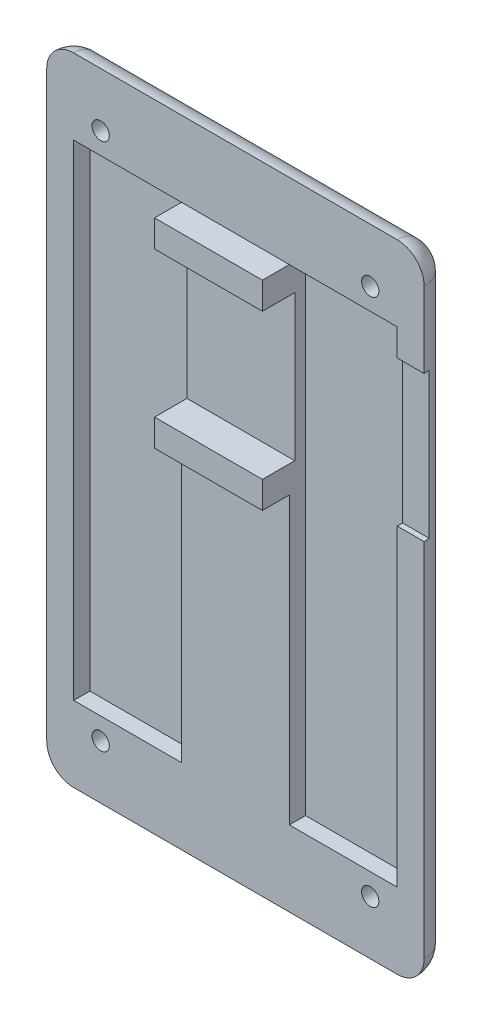
ISO-10303-21;
HEADER;
FILE_DESCRIPTION(('STEP AP214'),'2;1');
FILE_NAME('part.step','',(''),(''),'','','');
FILE_SCHEMA(('AUTOMOTIVE_DESIGN { 1 0 10303 214 1 1 1 1 }'));
ENDSEC;
DATA;
#1=APPLICATION_CONTEXT('core data for automotive mechanical design processes');
#2=APPLICATION_PROTOCOL_DEFINITION('international standard','automotive_design',2000,#1);
#3=PRODUCT_CONTEXT('',#1,'mechanical');
#4=PRODUCT('Part','Part','',(#3));
#5=PRODUCT_RELATED_PRODUCT_CATEGORY('part','',(#4));
#6=PRODUCT_DEFINITION_FORMATION('','',#4);
#7=PRODUCT_DEFINITION_CONTEXT('part definition',#1,'design');
#8=PRODUCT_DEFINITION('design','',#6,#7);
#9=PRODUCT_DEFINITION_SHAPE('','',#8);
#10=(LENGTH_UNIT() NAMED_UNIT(*) SI_UNIT(.MILLI.,.METRE.));
#11=(NAMED_UNIT(*) PLANE_ANGLE_UNIT() SI_UNIT($,.RADIAN.));
#12=(NAMED_UNIT(*) SI_UNIT($,.STERADIAN.) SOLID_ANGLE_UNIT());
#13=UNCERTAINTY_MEASURE_WITH_UNIT(LENGTH_MEASURE(1.E-05),#10,'distance_accuracy_value','');
#14=(GEOMETRIC_REPRESENTATION_CONTEXT(3) GLOBAL_UNCERTAINTY_ASSIGNED_CONTEXT((#13)) GLOBAL_UNIT_ASSIGNED_CONTEXT((#10,
#11,#12)) REPRESENTATION_CONTEXT('',''));
#15=CARTESIAN_POINT('',(0.,0.,0.));
#16=DIRECTION('',(0.,0.,1.));
#17=DIRECTION('',(1.,0.,0.));
#18=AXIS2_PLACEMENT_3D('',#15,#16,#17);
#19=CARTESIAN_POINT('',(0.,0.,5.));
#20=DIRECTION('',(0.,0.,-1.));
#21=DIRECTION('',(-1.,0.,0.));
#22=AXIS2_PLACEMENT_3D('',#19,#20,#21);
#23=PLANE('',#22);
#24=CARTESIAN_POINT('',(25.,49.,5.));
#25=DIRECTION('',(0.,0.,1.));
#26=DIRECTION('',(1.,0.,0.));
#27=AXIS2_PLACEMENT_3D('',#24,#25,#26);
#28=CIRCLE('',#27,1.6);
#29=CARTESIAN_POINT('',(26.6,49.,5.));
#30=VERTEX_POINT('',#29);
#31=EDGE_CURVE('E351',#30,#30,#28,.T.);
#32=ORIENTED_EDGE('',*,*,#31,.F.);
#33=EDGE_LOOP('',(#32));
#34=FACE_BOUND('',#33,.T.);
#35=CARTESIAN_POINT('',(-25.,-49.,5.));
#36=DIRECTION('',(0.,0.,1.));
#37=DIRECTION('',(1.,0.,0.));
#38=AXIS2_PLACEMENT_3D('',#35,#36,#37);
#39=CIRCLE('',#38,1.6);
#40=CARTESIAN_POINT('',(-23.4,-49.,5.));
#41=VERTEX_POINT('',#40);
#42=EDGE_CURVE('E357',#41,#41,#39,.T.);
#43=ORIENTED_EDGE('',*,*,#42,.F.);
#44=EDGE_LOOP('',(#43));
#45=FACE_BOUND('',#44,.T.);
#46=CARTESIAN_POINT('',(25.,-49.,5.));
#47=DIRECTION('',(0.,0.,1.));
#48=DIRECTION('',(1.,0.,0.));
#49=AXIS2_PLACEMENT_3D('',#46,#47,#48);
#50=CIRCLE('',#49,1.6);
#51=CARTESIAN_POINT('',(26.6,-49.,5.));
#52=VERTEX_POINT('',#51);
#53=EDGE_CURVE('E363',#52,#52,#50,.T.);
#54=ORIENTED_EDGE('',*,*,#53,.F.);
#55=EDGE_LOOP('',(#54));
#56=FACE_BOUND('',#55,.T.);
#57=CARTESIAN_POINT('',(-25.,49.,5.));
#58=DIRECTION('',(0.,0.,1.));
#59=DIRECTION('',(1.,0.,0.));
#60=AXIS2_PLACEMENT_3D('',#57,#58,#59);
#61=CIRCLE('',#60,1.6);
#62=CARTESIAN_POINT('',(-23.4,49.,5.));
#63=VERTEX_POINT('',#62);
#64=EDGE_CURVE('E350',#63,#63,#61,.T.);
#65=ORIENTED_EDGE('',*,*,#64,.F.);
#66=EDGE_LOOP('',(#65));
#67=FACE_BOUND('',#66,.T.);
#68=DIRECTION('',(-1.,0.,0.));
#69=VECTOR('',#68,1.);
#70=CARTESIAN_POINT('',(-10.,45.,5.));
#71=LINE('',#70,#69);
#72=CARTESIAN_POINT('',(10.,45.,5.));
#73=VERTEX_POINT('',#72);
#74=CARTESIAN_POINT('',(-10.,45.,5.));
#75=VERTEX_POINT('',#74);
#76=EDGE_CURVE('E232',#73,#75,#71,.T.);
#77=ORIENTED_EDGE('',*,*,#76,.F.);
#78=DIRECTION('',(-1.,0.,0.));
#79=VECTOR('',#78,1.);
#80=CARTESIAN_POINT('',(10.,45.,5.));
#81=LINE('',#80,#79);
#82=CARTESIAN_POINT('',(30.,45.,5.));
#83=VERTEX_POINT('',#82);
#84=EDGE_CURVE('E263',#83,#73,#81,.T.);
#85=ORIENTED_EDGE('',*,*,#84,.F.);
#86=DIRECTION('',(0.,1.,0.));
#87=VECTOR('',#86,1.);
#88=CARTESIAN_POINT('',(30.,-45.,5.));
#89=LINE('',#88,#87);
#90=CARTESIAN_POINT('',(30.,40.,5.));
#91=VERTEX_POINT('',#90);
#92=EDGE_CURVE('E277',#91,#83,#89,.T.);
#93=ORIENTED_EDGE('',*,*,#92,.F.);
#94=DIRECTION('',(-1.,0.,0.));
#95=VECTOR('',#94,1.);
#96=CARTESIAN_POINT('',(35.,40.,5.));
#97=LINE('',#96,#95);
#98=CARTESIAN_POINT('',(35.,40.,5.));
#99=VERTEX_POINT('',#98);
#100=EDGE_CURVE('E333',#99,#91,#97,.T.);
#101=ORIENTED_EDGE('',*,*,#100,.F.);
#102=DIRECTION('',(0.,1.,0.));
#103=VECTOR('',#102,1.);
#104=CARTESIAN_POINT('',(35.,59.,5.));
#105=LINE('',#104,#103);
#106=CARTESIAN_POINT('',(35.,54.,5.));
#107=VERTEX_POINT('',#106);
#108=EDGE_CURVE('E390',#99,#107,#105,.T.);
#109=ORIENTED_EDGE('',*,*,#108,.T.);
#110=CARTESIAN_POINT('',(30.,54.,5.));
#111=DIRECTION('',(0.,0.,-1.));
#112=DIRECTION('',(-1.,0.,0.));
#113=AXIS2_PLACEMENT_3D('',#110,#111,#112);
#114=CIRCLE('',#113,5.);
#115=CARTESIAN_POINT('',(30.,59.,5.));
#116=VERTEX_POINT('',#115);
#117=EDGE_CURVE('E422',#116,#107,#114,.T.);
#118=ORIENTED_EDGE('',*,*,#117,.F.);
#119=DIRECTION('',(-1.,0.,0.));
#120=VECTOR('',#119,1.);
#121=CARTESIAN_POINT('',(-35.,59.,5.));
#122=LINE('',#121,#120);
#123=CARTESIAN_POINT('',(-30.,59.,5.));
#124=VERTEX_POINT('',#123);
#125=EDGE_CURVE('E386',#116,#124,#122,.T.);
#126=ORIENTED_EDGE('',*,*,#125,.T.);
#127=CARTESIAN_POINT('',(-30.,54.,5.));
#128=DIRECTION('',(0.,0.,-1.));
#129=DIRECTION('',(-1.,0.,0.));
#130=AXIS2_PLACEMENT_3D('',#127,#128,#129);
#131=CIRCLE('',#130,5.);
#132=CARTESIAN_POINT('',(-35.,54.,5.));
#133=VERTEX_POINT('',#132);
#134=EDGE_CURVE('E366',#133,#124,#131,.T.);
#135=ORIENTED_EDGE('',*,*,#134,.F.);
#136=DIRECTION('',(0.,-1.,0.));
#137=VECTOR('',#136,1.);
#138=CARTESIAN_POINT('',(-35.,-59.,5.));
#139=LINE('',#138,#137);
#140=CARTESIAN_POINT('',(-35.,-54.,5.));
#141=VERTEX_POINT('',#140);
#142=EDGE_CURVE('E388',#133,#141,#139,.T.);
#143=ORIENTED_EDGE('',*,*,#142,.T.);
#144=CARTESIAN_POINT('',(-30.,-54.,5.));
#145=DIRECTION('',(0.,0.,-1.));
#146=DIRECTION('',(-1.,0.,0.));
#147=AXIS2_PLACEMENT_3D('',#144,#145,#146);
#148=CIRCLE('',#147,5.);
#149=CARTESIAN_POINT('',(-30.,-59.,5.));
#150=VERTEX_POINT('',#149);
#151=EDGE_CURVE('E419',#150,#141,#148,.T.);
#152=ORIENTED_EDGE('',*,*,#151,.F.);
#153=DIRECTION('',(1.,0.,0.));
#154=VECTOR('',#153,1.);
#155=CARTESIAN_POINT('',(35.,-59.,5.));
#156=LINE('',#155,#154);
#157=CARTESIAN_POINT('',(30.,-59.,5.));
#158=VERTEX_POINT('',#157);
#159=EDGE_CURVE('E370',#150,#158,#156,.T.);
#160=ORIENTED_EDGE('',*,*,#159,.T.);
#161=CARTESIAN_POINT('',(30.,-54.,5.));
#162=DIRECTION('',(0.,0.,-1.));
#163=DIRECTION('',(-1.,0.,0.));
#164=AXIS2_PLACEMENT_3D('',#161,#162,#163);
#165=CIRCLE('',#164,5.);
#166=CARTESIAN_POINT('',(35.,-54.,5.));
#167=VERTEX_POINT('',#166);
#168=EDGE_CURVE('E342',#167,#158,#165,.T.);
#169=ORIENTED_EDGE('',*,*,#168,.F.);
#170=CARTESIAN_POINT('',(35.,13.,5.));
#171=VERTEX_POINT('',#170);
#172=EDGE_CURVE('E391',#167,#171,#105,.T.);
#173=ORIENTED_EDGE('',*,*,#172,.T.);
#174=DIRECTION('',(1.,0.,0.));
#175=VECTOR('',#174,1.);
#176=CARTESIAN_POINT('',(35.,13.,5.));
#177=LINE('',#176,#175);
#178=CARTESIAN_POINT('',(30.,13.,5.));
#179=VERTEX_POINT('',#178);
#180=EDGE_CURVE('E345',#179,#171,#177,.T.);
#181=ORIENTED_EDGE('',*,*,#180,.F.);
#182=CARTESIAN_POINT('',(30.,-45.,5.));
#183=VERTEX_POINT('',#182);
#184=EDGE_CURVE('E278',#183,#179,#89,.T.);
#185=ORIENTED_EDGE('',*,*,#184,.F.);
#186=DIRECTION('',(1.,0.,0.));
#187=VECTOR('',#186,1.);
#188=CARTESIAN_POINT('',(9.99999999999998,-45.,5.));
#189=LINE('',#188,#187);
#190=CARTESIAN_POINT('',(9.99999999999998,-45.,5.));
#191=VERTEX_POINT('',#190);
#192=EDGE_CURVE('E274',#191,#183,#189,.T.);
#193=ORIENTED_EDGE('',*,*,#192,.F.);
#194=DIRECTION('',(0.,-1.,0.));
#195=VECTOR('',#194,1.);
#196=CARTESIAN_POINT('',(9.99999999999998,-45.,5.));
#197=LINE('',#196,#195);
#198=CARTESIAN_POINT('',(9.99999999999999,7.99999999999996,5.));
#199=VERTEX_POINT('',#198);
#200=EDGE_CURVE('E258',#199,#191,#197,.T.);
#201=ORIENTED_EDGE('',*,*,#200,.F.);
#202=DIRECTION('',(1.,0.,0.));
#203=VECTOR('',#202,1.);
#204=CARTESIAN_POINT('',(-10.,7.99999999999997,5.));
#205=LINE('',#204,#203);
#206=CARTESIAN_POINT('',(-10.,7.99999999999997,5.));
#207=VERTEX_POINT('',#206);
#208=EDGE_CURVE('E242',#207,#199,#205,.T.);
#209=ORIENTED_EDGE('',*,*,#208,.F.);
#210=DIRECTION('',(0.,1.,0.));
#211=VECTOR('',#210,1.);
#212=CARTESIAN_POINT('',(-10.,-45.,5.));
#213=LINE('',#212,#211);
#214=CARTESIAN_POINT('',(-10.,-45.,5.));
#215=VERTEX_POINT('',#214);
#216=EDGE_CURVE('E320',#215,#207,#213,.T.);
#217=ORIENTED_EDGE('',*,*,#216,.F.);
#218=DIRECTION('',(1.,0.,0.));
#219=VECTOR('',#218,1.);
#220=CARTESIAN_POINT('',(-30.,-45.,5.));
#221=LINE('',#220,#219);
#222=CARTESIAN_POINT('',(-30.,-45.,5.));
#223=VERTEX_POINT('',#222);
#224=EDGE_CURVE('E317',#223,#215,#221,.T.);
#225=ORIENTED_EDGE('',*,*,#224,.F.);
#226=DIRECTION('',(0.,-1.,0.));
#227=VECTOR('',#226,1.);
#228=CARTESIAN_POINT('',(-30.,-45.,5.));
#229=LINE('',#228,#227);
#230=CARTESIAN_POINT('',(-30.,45.,5.));
#231=VERTEX_POINT('',#230);
#232=EDGE_CURVE('E300',#231,#223,#229,.T.);
#233=ORIENTED_EDGE('',*,*,#232,.F.);
#234=DIRECTION('',(-1.,0.,0.));
#235=VECTOR('',#234,1.);
#236=CARTESIAN_POINT('',(-30.,45.,5.));
#237=LINE('',#236,#235);
#238=EDGE_CURVE('E305',#75,#231,#237,.T.);
#239=ORIENTED_EDGE('',*,*,#238,.F.);
#240=EDGE_LOOP('',(#77,#85,#93,#101,#109,#118,#126,#135,#143,#152,#160,#169,#173,#181,#185,#193,
#201,#209,#217,#225,#233,#239));
#241=FACE_BOUND('',#240,.T.);
#242=ADVANCED_FACE('F39',(#34,#45,#56,#67,#241),#23,.F.);
#243=CARTESIAN_POINT('',(35.,13.,4.));
#244=DIRECTION('',(0.,-1.,0.));
#245=DIRECTION('',(1.,0.,0.));
#246=AXIS2_PLACEMENT_3D('',#243,#244,#245);
#247=PLANE('',#246);
#248=DIRECTION('',(0.,0.,1.));
#249=VECTOR('',#248,1.);
#250=CARTESIAN_POINT('',(-10.,13.,4.));
#251=LINE('',#250,#249);
#252=CARTESIAN_POINT('',(-9.99999999999999,13.,4.));
#253=VERTEX_POINT('',#252);
#254=CARTESIAN_POINT('',(-10.,13.,10.));
#255=VERTEX_POINT('',#254);
#256=EDGE_CURVE('E217',#253,#255,#251,.T.);
#257=ORIENTED_EDGE('',*,*,#256,.T.);
#258=DIRECTION('',(-1.,0.,0.));
#259=VECTOR('',#258,1.);
#260=CARTESIAN_POINT('',(-10.,13.,10.));
#261=LINE('',#260,#259);
#262=CARTESIAN_POINT('',(9.99999999999999,13.,10.));
#263=VERTEX_POINT('',#262);
#264=EDGE_CURVE('E251',#263,#255,#261,.T.);
#265=ORIENTED_EDGE('',*,*,#264,.F.);
#266=DIRECTION('',(0.,0.,-1.));
#267=VECTOR('',#266,1.);
#268=CARTESIAN_POINT('',(9.99999999999999,13.,4.));
#269=LINE('',#268,#267);
#270=CARTESIAN_POINT('',(9.99999999999999,13.,4.));
#271=VERTEX_POINT('',#270);
#272=EDGE_CURVE('E297',#263,#271,#269,.T.);
#273=ORIENTED_EDGE('',*,*,#272,.T.);
#274=DIRECTION('',(1.,0.,0.));
#275=VECTOR('',#274,1.);
#276=CARTESIAN_POINT('',(35.,13.,4.));
#277=LINE('',#276,#275);
#278=EDGE_CURVE('E339',#253,#271,#277,.T.);
#279=ORIENTED_EDGE('',*,*,#278,.F.);
#280=EDGE_LOOP('',(#257,#265,#273,#279));
#281=FACE_BOUND('',#280,.T.);
#282=ADVANCED_FACE('F470',(#281),#247,.F.);
#283=CARTESIAN_POINT('',(35.,40.,4.));
#284=DIRECTION('',(0.,1.,0.));
#285=DIRECTION('',(-1.,0.,0.));
#286=AXIS2_PLACEMENT_3D('',#283,#284,#285);
#287=PLANE('',#286);
#288=DIRECTION('',(-1.,0.,0.));
#289=VECTOR('',#288,1.);
#290=CARTESIAN_POINT('',(35.,40.,4.));
#291=LINE('',#290,#289);
#292=CARTESIAN_POINT('',(9.99999999999999,40.,4.));
#293=VERTEX_POINT('',#292);
#294=CARTESIAN_POINT('',(-10.,40.,4.));
#295=VERTEX_POINT('',#294);
#296=EDGE_CURVE('E338',#293,#295,#291,.T.);
#297=ORIENTED_EDGE('',*,*,#296,.F.);
#298=DIRECTION('',(0.,0.,1.));
#299=VECTOR('',#298,1.);
#300=CARTESIAN_POINT('',(10.,40.,4.));
#301=LINE('',#300,#299);
#302=CARTESIAN_POINT('',(10.,40.,10.));
#303=VERTEX_POINT('',#302);
#304=EDGE_CURVE('E223',#293,#303,#301,.T.);
#305=ORIENTED_EDGE('',*,*,#304,.T.);
#306=DIRECTION('',(1.,0.,0.));
#307=VECTOR('',#306,1.);
#308=CARTESIAN_POINT('',(-10.,40.,10.));
#309=LINE('',#308,#307);
#310=CARTESIAN_POINT('',(-10.,40.,10.));
#311=VERTEX_POINT('',#310);
#312=EDGE_CURVE('E221',#311,#303,#309,.T.);
#313=ORIENTED_EDGE('',*,*,#312,.F.);
#314=DIRECTION('',(0.,0.,-1.));
#315=VECTOR('',#314,1.);
#316=CARTESIAN_POINT('',(-10.,40.,4.));
#317=LINE('',#316,#315);
#318=EDGE_CURVE('E207',#311,#295,#317,.T.);
#319=ORIENTED_EDGE('',*,*,#318,.T.);
#320=EDGE_LOOP('',(#297,#305,#313,#319));
#321=FACE_BOUND('',#320,.T.);
#322=ADVANCED_FACE('F222',(#321),#287,.F.);
#323=CARTESIAN_POINT('',(0.,0.,4.));
#324=DIRECTION('',(0.,0.,1.));
#325=DIRECTION('',(1.,0.,0.));
#326=AXIS2_PLACEMENT_3D('',#323,#324,#325);
#327=PLANE('',#326);
#328=DIRECTION('',(0.,-1.,0.));
#329=VECTOR('',#328,1.);
#330=CARTESIAN_POINT('',(9.99999999999999,0.,4.));
#331=LINE('',#330,#329);
#332=EDGE_CURVE('E11',#293,#271,#331,.T.);
#333=ORIENTED_EDGE('',*,*,#332,.F.);
#334=ORIENTED_EDGE('',*,*,#296,.T.);
#335=DIRECTION('',(0.,1.,0.));
#336=VECTOR('',#335,1.);
#337=CARTESIAN_POINT('',(-10.,0.,4.));
#338=LINE('',#337,#336);
#339=EDGE_CURVE('E214',#253,#295,#338,.T.);
#340=ORIENTED_EDGE('',*,*,#339,.F.);
#341=ORIENTED_EDGE('',*,*,#278,.T.);
#342=EDGE_LOOP('',(#333,#334,#340,#341));
#343=FACE_BOUND('',#342,.T.);
#344=ADVANCED_FACE('F498',(#343),#327,.T.);
#345=CARTESIAN_POINT('',(0.,0.,0.));
#346=DIRECTION('',(0.,0.,-1.));
#347=DIRECTION('',(-1.,0.,0.));
#348=AXIS2_PLACEMENT_3D('',#345,#346,#347);
#349=PLANE('',#348);
#350=DIRECTION('',(1.,0.,0.));
#351=VECTOR('',#350,1.);
#352=CARTESIAN_POINT('',(-35.,-54.,0.));
#353=LINE('',#352,#351);
#354=CARTESIAN_POINT('',(30.,-54.,0.));
#355=VERTEX_POINT('',#354);
#356=CARTESIAN_POINT('',(-30.,-54.,0.));
#357=VERTEX_POINT('',#356);
#358=EDGE_CURVE('E380',#355,#357,#353,.F.);
#359=ORIENTED_EDGE('',*,*,#358,.T.);
#360=DIRECTION('',(0.,-1.,0.));
#361=VECTOR('',#360,1.);
#362=CARTESIAN_POINT('',(-30.,59.,0.));
#363=LINE('',#362,#361);
#364=CARTESIAN_POINT('',(-30.,54.,0.));
#365=VERTEX_POINT('',#364);
#366=EDGE_CURVE('E383',#357,#365,#363,.F.);
#367=ORIENTED_EDGE('',*,*,#366,.T.);
#368=DIRECTION('',(-1.,0.,0.));
#369=VECTOR('',#368,1.);
#370=CARTESIAN_POINT('',(35.,54.,0.));
#371=LINE('',#370,#369);
#372=CARTESIAN_POINT('',(30.,54.,0.));
#373=VERTEX_POINT('',#372);
#374=EDGE_CURVE('E377',#365,#373,#371,.F.);
#375=ORIENTED_EDGE('',*,*,#374,.T.);
#376=DIRECTION('',(0.,1.,0.));
#377=VECTOR('',#376,1.);
#378=CARTESIAN_POINT('',(30.,-59.,0.));
#379=LINE('',#378,#377);
#380=EDGE_CURVE('E374',#373,#355,#379,.F.);
#381=ORIENTED_EDGE('',*,*,#380,.T.);
#382=EDGE_LOOP('',(#359,#367,#375,#381));
#383=FACE_BOUND('',#382,.T.);
#384=CARTESIAN_POINT('',(25.,49.,0.));
#385=DIRECTION('',(0.,0.,1.));
#386=DIRECTION('',(1.,0.,0.));
#387=AXIS2_PLACEMENT_3D('',#384,#385,#386);
#388=CIRCLE('',#387,1.6);
#389=CARTESIAN_POINT('',(26.6,49.,0.));
#390=VERTEX_POINT('',#389);
#391=EDGE_CURVE('E347',#390,#390,#388,.T.);
#392=ORIENTED_EDGE('',*,*,#391,.T.);
#393=EDGE_LOOP('',(#392));
#394=FACE_BOUND('',#393,.T.);
#395=CARTESIAN_POINT('',(-25.,-49.,0.));
#396=DIRECTION('',(0.,0.,1.));
#397=DIRECTION('',(1.,0.,0.));
#398=AXIS2_PLACEMENT_3D('',#395,#396,#397);
#399=CIRCLE('',#398,1.6);
#400=CARTESIAN_POINT('',(-23.4,-49.,0.));
#401=VERTEX_POINT('',#400);
#402=EDGE_CURVE('E354',#401,#401,#399,.T.);
#403=ORIENTED_EDGE('',*,*,#402,.T.);
#404=EDGE_LOOP('',(#403));
#405=FACE_BOUND('',#404,.T.);
#406=CARTESIAN_POINT('',(25.,-49.,0.));
#407=DIRECTION('',(0.,0.,1.));
#408=DIRECTION('',(1.,0.,0.));
#409=AXIS2_PLACEMENT_3D('',#406,#407,#408);
#410=CIRCLE('',#409,1.6);
#411=CARTESIAN_POINT('',(26.6,-49.,0.));
#412=VERTEX_POINT('',#411);
#413=EDGE_CURVE('E360',#412,#412,#410,.T.);
#414=ORIENTED_EDGE('',*,*,#413,.T.);
#415=EDGE_LOOP('',(#414));
#416=FACE_BOUND('',#415,.T.);
#417=CARTESIAN_POINT('',(-25.,49.,0.));
#418=DIRECTION('',(0.,0.,1.));
#419=DIRECTION('',(1.,0.,0.));
#420=AXIS2_PLACEMENT_3D('',#417,#418,#419);
#421=CIRCLE('',#420,1.6);
#422=CARTESIAN_POINT('',(-23.4,49.,0.));
#423=VERTEX_POINT('',#422);
#424=EDGE_CURVE('E367',#423,#423,#421,.T.);
#425=ORIENTED_EDGE('',*,*,#424,.T.);
#426=EDGE_LOOP('',(#425));
#427=FACE_BOUND('',#426,.T.);
#428=ADVANCED_FACE('F495',(#383,#394,#405,#416,#427),#349,.T.);
#429=CARTESIAN_POINT('',(-25.,49.,0.));
#430=DIRECTION('',(0.,0.,1.));
#431=DIRECTION('',(1.,0.,0.));
#432=AXIS2_PLACEMENT_3D('',#429,#430,#431);
#433=CYLINDRICAL_SURFACE('',#432,1.6);
#434=ORIENTED_EDGE('',*,*,#424,.F.);
#435=EDGE_LOOP('',(#434));
#436=FACE_BOUND('',#435,.T.);
#437=ORIENTED_EDGE('',*,*,#64,.T.);
#438=EDGE_LOOP('',(#437));
#439=FACE_BOUND('',#438,.T.);
#440=ADVANCED_FACE('F493',(#436,#439),#433,.F.);
#441=CARTESIAN_POINT('',(25.,-49.,0.));
#442=DIRECTION('',(0.,0.,1.));
#443=DIRECTION('',(1.,0.,0.));
#444=AXIS2_PLACEMENT_3D('',#441,#442,#443);
#445=CYLINDRICAL_SURFACE('',#444,1.6);
#446=ORIENTED_EDGE('',*,*,#413,.F.);
#447=EDGE_LOOP('',(#446));
#448=FACE_BOUND('',#447,.T.);
#449=ORIENTED_EDGE('',*,*,#53,.T.);
#450=EDGE_LOOP('',(#449));
#451=FACE_BOUND('',#450,.T.);
#452=ADVANCED_FACE('F550',(#448,#451),#445,.F.);
#453=CARTESIAN_POINT('',(-25.,-49.,0.));
#454=DIRECTION('',(0.,0.,1.));
#455=DIRECTION('',(1.,0.,0.));
#456=AXIS2_PLACEMENT_3D('',#453,#454,#455);
#457=CYLINDRICAL_SURFACE('',#456,1.6);
#458=ORIENTED_EDGE('',*,*,#402,.F.);
#459=EDGE_LOOP('',(#458));
#460=FACE_BOUND('',#459,.T.);
#461=ORIENTED_EDGE('',*,*,#42,.T.);
#462=EDGE_LOOP('',(#461));
#463=FACE_BOUND('',#462,.T.);
#464=ADVANCED_FACE('F556',(#460,#463),#457,.F.);
#465=CARTESIAN_POINT('',(25.,49.,0.));
#466=DIRECTION('',(0.,0.,1.));
#467=DIRECTION('',(1.,0.,0.));
#468=AXIS2_PLACEMENT_3D('',#465,#466,#467);
#469=CYLINDRICAL_SURFACE('',#468,1.6);
#470=ORIENTED_EDGE('',*,*,#391,.F.);
#471=EDGE_LOOP('',(#470));
#472=FACE_BOUND('',#471,.T.);
#473=ORIENTED_EDGE('',*,*,#31,.T.);
#474=EDGE_LOOP('',(#473));
#475=FACE_BOUND('',#474,.T.);
#476=ADVANCED_FACE('F514',(#472,#475),#469,.F.);
#477=CARTESIAN_POINT('',(-35.,54.,5.));
#478=DIRECTION('',(1.,0.,0.));
#479=DIRECTION('',(0.,0.,-1.));
#480=AXIS2_PLACEMENT_3D('',#477,#478,#479);
#481=CYLINDRICAL_SURFACE('',#480,5.);
#482=ORIENTED_EDGE('',*,*,#374,.F.);
#483=CARTESIAN_POINT('',(-30.,54.,5.));
#484=DIRECTION('',(1.,0.,0.));
#485=DIRECTION('',(0.,0.,-1.));
#486=AXIS2_PLACEMENT_3D('',#483,#484,#485);
#487=CIRCLE('',#486,5.);
#488=EDGE_CURVE('E402',#365,#124,#487,.T.);
#489=ORIENTED_EDGE('',*,*,#488,.T.);
#490=ORIENTED_EDGE('',*,*,#125,.F.);
#491=CARTESIAN_POINT('',(30.,54.,5.));
#492=DIRECTION('',(1.,0.,0.));
#493=DIRECTION('',(0.,0.,-1.));
#494=AXIS2_PLACEMENT_3D('',#491,#492,#493);
#495=CIRCLE('',#494,5.);
#496=EDGE_CURVE('E400',#116,#373,#495,.F.);
#497=ORIENTED_EDGE('',*,*,#496,.T.);
#498=EDGE_LOOP('',(#482,#489,#490,#497));
#499=FACE_BOUND('',#498,.T.);
#500=ADVANCED_FACE('F510',(#499),#481,.T.);
#501=CARTESIAN_POINT('',(-30.,-59.,5.));
#502=DIRECTION('',(0.,1.,0.));
#503=DIRECTION('',(0.,0.,1.));
#504=AXIS2_PLACEMENT_3D('',#501,#502,#503);
#505=CYLINDRICAL_SURFACE('',#504,5.);
#506=ORIENTED_EDGE('',*,*,#142,.F.);
#507=CARTESIAN_POINT('',(-30.,54.,5.));
#508=DIRECTION('',(0.,1.,0.));
#509=DIRECTION('',(0.,0.,1.));
#510=AXIS2_PLACEMENT_3D('',#507,#508,#509);
#511=CIRCLE('',#510,5.);
#512=EDGE_CURVE('E397',#133,#365,#511,.F.);
#513=ORIENTED_EDGE('',*,*,#512,.T.);
#514=ORIENTED_EDGE('',*,*,#366,.F.);
#515=CARTESIAN_POINT('',(-30.,-54.,5.));
#516=DIRECTION('',(0.,1.,0.));
#517=DIRECTION('',(0.,0.,1.));
#518=AXIS2_PLACEMENT_3D('',#515,#516,#517);
#519=CIRCLE('',#518,5.);
#520=EDGE_CURVE('E394',#357,#141,#519,.T.);
#521=ORIENTED_EDGE('',*,*,#520,.T.);
#522=EDGE_LOOP('',(#506,#513,#514,#521));
#523=FACE_BOUND('',#522,.T.);
#524=ADVANCED_FACE('F507',(#523),#505,.T.);
#525=CARTESIAN_POINT('',(30.,-59.,5.));
#526=DIRECTION('',(0.,-1.,0.));
#527=DIRECTION('',(0.,0.,-1.));
#528=AXIS2_PLACEMENT_3D('',#525,#526,#527);
#529=CYLINDRICAL_SURFACE('',#528,5.);
#530=CARTESIAN_POINT('',(30.,13.,5.));
#531=DIRECTION('',(0.,-1.,0.));
#532=DIRECTION('',(1.,0.,0.));
#533=AXIS2_PLACEMENT_3D('',#530,#531,#532);
#534=CIRCLE('',#533,5.);
#535=CARTESIAN_POINT('',(34.8989794855664,13.,4.));
#536=VERTEX_POINT('',#535);
#537=EDGE_CURVE('E431',#171,#536,#534,.F.);
#538=ORIENTED_EDGE('',*,*,#537,.F.);
#539=ORIENTED_EDGE('',*,*,#172,.F.);
#540=CARTESIAN_POINT('',(30.,-54.,5.));
#541=DIRECTION('',(0.,-1.,0.));
#542=DIRECTION('',(0.,0.,-1.));
#543=AXIS2_PLACEMENT_3D('',#540,#541,#542);
#544=CIRCLE('',#543,5.);
#545=EDGE_CURVE('E411',#167,#355,#544,.F.);
#546=ORIENTED_EDGE('',*,*,#545,.T.);
#547=ORIENTED_EDGE('',*,*,#380,.F.);
#548=CARTESIAN_POINT('',(30.,54.,5.));
#549=DIRECTION('',(0.,-1.,0.));
#550=DIRECTION('',(0.,0.,-1.));
#551=AXIS2_PLACEMENT_3D('',#548,#549,#550);
#552=CIRCLE('',#551,5.);
#553=EDGE_CURVE('E413',#373,#107,#552,.T.);
#554=ORIENTED_EDGE('',*,*,#553,.T.);
#555=ORIENTED_EDGE('',*,*,#108,.F.);
#556=CARTESIAN_POINT('',(30.,40.,5.));
#557=DIRECTION('',(0.,1.,0.));
#558=DIRECTION('',(-1.,0.,0.));
#559=AXIS2_PLACEMENT_3D('',#556,#557,#558);
#560=CIRCLE('',#559,5.);
#561=CARTESIAN_POINT('',(34.8989794855664,40.,4.));
#562=VERTEX_POINT('',#561);
#563=EDGE_CURVE('E429',#562,#99,#560,.F.);
#564=ORIENTED_EDGE('',*,*,#563,.F.);
#565=DIRECTION('',(0.,-1.,0.));
#566=VECTOR('',#565,1.);
#567=CARTESIAN_POINT('',(34.8989794855664,-59.,4.));
#568=LINE('',#567,#566);
#569=EDGE_CURVE('E416',#562,#536,#568,.T.);
#570=ORIENTED_EDGE('',*,*,#569,.T.);
#571=EDGE_LOOP('',(#538,#539,#546,#547,#554,#555,#564,#570));
#572=FACE_BOUND('',#571,.T.);
#573=ADVANCED_FACE('F446',(#572),#529,.T.);
#574=CARTESIAN_POINT('',(-35.,-54.,5.));
#575=DIRECTION('',(-1.,0.,0.));
#576=DIRECTION('',(0.,0.,1.));
#577=AXIS2_PLACEMENT_3D('',#574,#575,#576);
#578=CYLINDRICAL_SURFACE('',#577,5.);
#579=ORIENTED_EDGE('',*,*,#159,.F.);
#580=CARTESIAN_POINT('',(-30.,-54.,5.));
#581=DIRECTION('',(-1.,0.,0.));
#582=DIRECTION('',(0.,0.,1.));
#583=AXIS2_PLACEMENT_3D('',#580,#581,#582);
#584=CIRCLE('',#583,5.);
#585=EDGE_CURVE('E408',#150,#357,#584,.F.);
#586=ORIENTED_EDGE('',*,*,#585,.T.);
#587=ORIENTED_EDGE('',*,*,#358,.F.);
#588=CARTESIAN_POINT('',(30.,-54.,5.));
#589=DIRECTION('',(-1.,0.,0.));
#590=DIRECTION('',(0.,0.,1.));
#591=AXIS2_PLACEMENT_3D('',#588,#589,#590);
#592=CIRCLE('',#591,5.);
#593=EDGE_CURVE('E405',#355,#158,#592,.T.);
#594=ORIENTED_EDGE('',*,*,#593,.T.);
#595=EDGE_LOOP('',(#579,#586,#587,#594));
#596=FACE_BOUND('',#595,.T.);
#597=ADVANCED_FACE('F500',(#596),#578,.T.);
#598=CARTESIAN_POINT('',(-30.,54.,5.));
#599=DIRECTION('',(0.,0.,1.));
#600=DIRECTION('',(1.,0.,0.));
#601=AXIS2_PLACEMENT_3D('',#598,#599,#600);
#602=SPHERICAL_SURFACE('',#601,5.);
#603=ORIENTED_EDGE('',*,*,#134,.T.);
#604=ORIENTED_EDGE('',*,*,#488,.F.);
#605=ORIENTED_EDGE('',*,*,#512,.F.);
#606=EDGE_LOOP('',(#603,#604,#605));
#607=FACE_BOUND('',#606,.T.);
#608=ADVANCED_FACE('F503',(#607),#602,.T.);
#609=CARTESIAN_POINT('',(-30.,-54.,5.));
#610=DIRECTION('',(0.,0.,1.));
#611=DIRECTION('',(1.,0.,0.));
#612=AXIS2_PLACEMENT_3D('',#609,#610,#611);
#613=SPHERICAL_SURFACE('',#612,5.);
#614=ORIENTED_EDGE('',*,*,#151,.T.);
#615=ORIENTED_EDGE('',*,*,#520,.F.);
#616=ORIENTED_EDGE('',*,*,#585,.F.);
#617=EDGE_LOOP('',(#614,#615,#616));
#618=FACE_BOUND('',#617,.T.);
#619=ADVANCED_FACE('F518',(#618),#613,.T.);
#620=CARTESIAN_POINT('',(30.,54.,5.));
#621=DIRECTION('',(0.,0.,1.));
#622=DIRECTION('',(1.,0.,0.));
#623=AXIS2_PLACEMENT_3D('',#620,#621,#622);
#624=SPHERICAL_SURFACE('',#623,5.);
#625=ORIENTED_EDGE('',*,*,#553,.F.);
#626=ORIENTED_EDGE('',*,*,#496,.F.);
#627=ORIENTED_EDGE('',*,*,#117,.T.);
#628=EDGE_LOOP('',(#625,#626,#627));
#629=FACE_BOUND('',#628,.T.);
#630=ADVANCED_FACE('F477',(#629),#624,.T.);
#631=CARTESIAN_POINT('',(30.,-54.,5.));
#632=DIRECTION('',(0.,0.,1.));
#633=DIRECTION('',(1.,0.,0.));
#634=AXIS2_PLACEMENT_3D('',#631,#632,#633);
#635=SPHERICAL_SURFACE('',#634,5.);
#636=ORIENTED_EDGE('',*,*,#593,.F.);
#637=ORIENTED_EDGE('',*,*,#545,.F.);
#638=ORIENTED_EDGE('',*,*,#168,.T.);
#639=EDGE_LOOP('',(#636,#637,#638));
#640=FACE_BOUND('',#639,.T.);
#641=ADVANCED_FACE('F41',(#640),#635,.T.);
#642=CARTESIAN_POINT('',(30.,13.,4.));
#643=VERTEX_POINT('',#642);
#644=EDGE_CURVE('E337',#643,#536,#277,.T.);
#645=ORIENTED_EDGE('',*,*,#644,.F.);
#646=DIRECTION('',(0.,0.,1.));
#647=VECTOR('',#646,1.);
#648=CARTESIAN_POINT('',(30.,13.,4.));
#649=LINE('',#648,#647);
#650=EDGE_CURVE('E62',#643,#179,#649,.T.);
#651=ORIENTED_EDGE('',*,*,#650,.T.);
#652=ORIENTED_EDGE('',*,*,#180,.T.);
#653=ORIENTED_EDGE('',*,*,#537,.T.);
#654=EDGE_LOOP('',(#645,#651,#652,#653));
#655=FACE_BOUND('',#654,.T.);
#656=ADVANCED_FACE('F467',(#655),#247,.F.);
#657=ORIENTED_EDGE('',*,*,#100,.T.);
#658=DIRECTION('',(0.,0.,-1.));
#659=VECTOR('',#658,1.);
#660=CARTESIAN_POINT('',(30.,40.,4.));
#661=LINE('',#660,#659);
#662=CARTESIAN_POINT('',(30.,40.,4.));
#663=VERTEX_POINT('',#662);
#664=EDGE_CURVE('E285',#91,#663,#661,.T.);
#665=ORIENTED_EDGE('',*,*,#664,.T.);
#666=EDGE_CURVE('E334',#562,#663,#291,.T.);
#667=ORIENTED_EDGE('',*,*,#666,.F.);
#668=ORIENTED_EDGE('',*,*,#563,.T.);
#669=EDGE_LOOP('',(#657,#665,#667,#668));
#670=FACE_BOUND('',#669,.T.);
#671=ADVANCED_FACE('F440',(#670),#287,.F.);
#672=DIRECTION('',(0.,1.,0.));
#673=VECTOR('',#672,1.);
#674=CARTESIAN_POINT('',(30.,0.,4.));
#675=LINE('',#674,#673);
#676=EDGE_CURVE('E47',#643,#663,#675,.T.);
#677=ORIENTED_EDGE('',*,*,#676,.F.);
#678=ORIENTED_EDGE('',*,*,#644,.T.);
#679=ORIENTED_EDGE('',*,*,#569,.F.);
#680=ORIENTED_EDGE('',*,*,#666,.T.);
#681=EDGE_LOOP('',(#677,#678,#679,#680));
#682=FACE_BOUND('',#681,.T.);
#683=ADVANCED_FACE('F443',(#682),#327,.T.);
#684=CARTESIAN_POINT('',(-10.,-45.,2.));
#685=DIRECTION('',(1.,0.,0.));
#686=DIRECTION('',(0.,0.,-1.));
#687=AXIS2_PLACEMENT_3D('',#684,#685,#686);
#688=PLANE('',#687);
#689=ORIENTED_EDGE('',*,*,#339,.T.);
#690=ORIENTED_EDGE('',*,*,#318,.F.);
#691=DIRECTION('',(0.,-1.,0.));
#692=VECTOR('',#691,1.);
#693=CARTESIAN_POINT('',(-10.,40.,10.));
#694=LINE('',#693,#692);
#695=CARTESIAN_POINT('',(-10.,45.,10.));
#696=VERTEX_POINT('',#695);
#697=EDGE_CURVE('E212',#696,#311,#694,.T.);
#698=ORIENTED_EDGE('',*,*,#697,.F.);
#699=DIRECTION('',(0.,0.,-1.));
#700=VECTOR('',#699,1.);
#701=CARTESIAN_POINT('',(-10.,45.,10.));
#702=LINE('',#701,#700);
#703=EDGE_CURVE('E237',#696,#75,#702,.T.);
#704=ORIENTED_EDGE('',*,*,#703,.T.);
#705=DIRECTION('',(0.,0.,1.));
#706=VECTOR('',#705,1.);
#707=CARTESIAN_POINT('',(-10.,45.,2.));
#708=LINE('',#707,#706);
#709=CARTESIAN_POINT('',(-10.,45.,2.));
#710=VERTEX_POINT('',#709);
#711=EDGE_CURVE('E326',#710,#75,#708,.T.);
#712=ORIENTED_EDGE('',*,*,#711,.F.);
#713=DIRECTION('',(0.,1.,0.));
#714=VECTOR('',#713,1.);
#715=CARTESIAN_POINT('',(-10.,-45.,2.));
#716=LINE('',#715,#714);
#717=CARTESIAN_POINT('',(-10.,-45.,2.));
#718=VERTEX_POINT('',#717);
#719=EDGE_CURVE('E308',#718,#710,#716,.T.);
#720=ORIENTED_EDGE('',*,*,#719,.F.);
#721=DIRECTION('',(0.,0.,1.));
#722=VECTOR('',#721,1.);
#723=CARTESIAN_POINT('',(-10.,-45.,2.));
#724=LINE('',#723,#722);
#725=EDGE_CURVE('E329',#718,#215,#724,.T.);
#726=ORIENTED_EDGE('',*,*,#725,.T.);
#727=ORIENTED_EDGE('',*,*,#216,.T.);
#728=DIRECTION('',(0.,0.,-1.));
#729=VECTOR('',#728,1.);
#730=CARTESIAN_POINT('',(-10.,7.99999999999997,10.));
#731=LINE('',#730,#729);
#732=CARTESIAN_POINT('',(-10.,7.99999999999997,10.));
#733=VERTEX_POINT('',#732);
#734=EDGE_CURVE('E256',#733,#207,#731,.T.);
#735=ORIENTED_EDGE('',*,*,#734,.F.);
#736=DIRECTION('',(0.,-1.,0.));
#737=VECTOR('',#736,1.);
#738=CARTESIAN_POINT('',(-10.,13.,10.));
#739=LINE('',#738,#737);
#740=EDGE_CURVE('E243',#255,#733,#739,.T.);
#741=ORIENTED_EDGE('',*,*,#740,.F.);
#742=ORIENTED_EDGE('',*,*,#256,.F.);
#743=EDGE_LOOP('',(#689,#690,#698,#704,#712,#720,#726,#727,#735,#741,#742));
#744=FACE_BOUND('',#743,.T.);
#745=ADVANCED_FACE('F209',(#744),#688,.F.);
#746=CARTESIAN_POINT('',(-30.,-45.,2.));
#747=DIRECTION('',(-1.,0.,0.));
#748=DIRECTION('',(0.,0.,1.));
#749=AXIS2_PLACEMENT_3D('',#746,#747,#748);
#750=PLANE('',#749);
#751=ORIENTED_EDGE('',*,*,#232,.T.);
#752=DIRECTION('',(0.,0.,1.));
#753=VECTOR('',#752,1.);
#754=CARTESIAN_POINT('',(-30.,-45.,2.));
#755=LINE('',#754,#753);
#756=CARTESIAN_POINT('',(-30.,-45.,2.));
#757=VERTEX_POINT('',#756);
#758=EDGE_CURVE('E314',#757,#223,#755,.T.);
#759=ORIENTED_EDGE('',*,*,#758,.F.);
#760=DIRECTION('',(0.,-1.,0.));
#761=VECTOR('',#760,1.);
#762=CARTESIAN_POINT('',(-30.,-45.,2.));
#763=LINE('',#762,#761);
#764=CARTESIAN_POINT('',(-30.,45.,2.));
#765=VERTEX_POINT('',#764);
#766=EDGE_CURVE('E301',#765,#757,#763,.T.);
#767=ORIENTED_EDGE('',*,*,#766,.F.);
#768=DIRECTION('',(0.,0.,1.));
#769=VECTOR('',#768,1.);
#770=CARTESIAN_POINT('',(-30.,45.,2.));
#771=LINE('',#770,#769);
#772=EDGE_CURVE('E218',#765,#231,#771,.T.);
#773=ORIENTED_EDGE('',*,*,#772,.T.);
#774=EDGE_LOOP('',(#751,#759,#767,#773));
#775=FACE_BOUND('',#774,.T.);
#776=ADVANCED_FACE('F645',(#775),#750,.F.);
#777=CARTESIAN_POINT('',(-30.,45.,2.));
#778=DIRECTION('',(0.,1.,0.));
#779=DIRECTION('',(0.,0.,1.));
#780=AXIS2_PLACEMENT_3D('',#777,#778,#779);
#781=PLANE('',#780);
#782=ORIENTED_EDGE('',*,*,#238,.T.);
#783=ORIENTED_EDGE('',*,*,#772,.F.);
#784=DIRECTION('',(-1.,0.,0.));
#785=VECTOR('',#784,1.);
#786=CARTESIAN_POINT('',(-30.,45.,2.));
#787=LINE('',#786,#785);
#788=EDGE_CURVE('E311',#710,#765,#787,.T.);
#789=ORIENTED_EDGE('',*,*,#788,.F.);
#790=ORIENTED_EDGE('',*,*,#711,.T.);
#791=EDGE_LOOP('',(#782,#783,#789,#790));
#792=FACE_BOUND('',#791,.T.);
#793=ADVANCED_FACE('F648',(#792),#781,.F.);
#794=CARTESIAN_POINT('',(-30.,-45.,2.));
#795=DIRECTION('',(0.,-1.,0.));
#796=DIRECTION('',(0.,0.,-1.));
#797=AXIS2_PLACEMENT_3D('',#794,#795,#796);
#798=PLANE('',#797);
#799=ORIENTED_EDGE('',*,*,#224,.T.);
#800=ORIENTED_EDGE('',*,*,#725,.F.);
#801=DIRECTION('',(1.,0.,0.));
#802=VECTOR('',#801,1.);
#803=CARTESIAN_POINT('',(-30.,-45.,2.));
#804=LINE('',#803,#802);
#805=EDGE_CURVE('E304',#757,#718,#804,.T.);
#806=ORIENTED_EDGE('',*,*,#805,.F.);
#807=ORIENTED_EDGE('',*,*,#758,.T.);
#808=EDGE_LOOP('',(#799,#800,#806,#807));
#809=FACE_BOUND('',#808,.T.);
#810=ADVANCED_FACE('F658',(#809),#798,.F.);
#811=CARTESIAN_POINT('',(0.,0.,2.));
#812=DIRECTION('',(0.,0.,-1.));
#813=DIRECTION('',(-1.,0.,0.));
#814=AXIS2_PLACEMENT_3D('',#811,#812,#813);
#815=PLANE('',#814);
#816=ORIENTED_EDGE('',*,*,#766,.T.);
#817=ORIENTED_EDGE('',*,*,#805,.T.);
#818=ORIENTED_EDGE('',*,*,#719,.T.);
#819=ORIENTED_EDGE('',*,*,#788,.T.);
#820=EDGE_LOOP('',(#816,#817,#818,#819));
#821=FACE_BOUND('',#820,.T.);
#822=ADVANCED_FACE('F669',(#821),#815,.F.);
#823=CARTESIAN_POINT('',(9.99999999999998,-45.,2.));
#824=DIRECTION('',(-1.,0.,0.));
#825=DIRECTION('',(0.,-1.,0.));
#826=AXIS2_PLACEMENT_3D('',#823,#824,#825);
#827=PLANE('',#826);
#828=ORIENTED_EDGE('',*,*,#272,.F.);
#829=DIRECTION('',(0.,1.,0.));
#830=VECTOR('',#829,1.);
#831=CARTESIAN_POINT('',(9.99999999999999,13.,10.));
#832=LINE('',#831,#830);
#833=CARTESIAN_POINT('',(10.,7.99999999999997,10.));
#834=VERTEX_POINT('',#833);
#835=EDGE_CURVE('E248',#834,#263,#832,.T.);
#836=ORIENTED_EDGE('',*,*,#835,.F.);
#837=DIRECTION('',(0.,0.,-1.));
#838=VECTOR('',#837,1.);
#839=CARTESIAN_POINT('',(10.,7.99999999999997,10.));
#840=LINE('',#839,#838);
#841=EDGE_CURVE('E54',#834,#199,#840,.T.);
#842=ORIENTED_EDGE('',*,*,#841,.T.);
#843=ORIENTED_EDGE('',*,*,#200,.T.);
#844=DIRECTION('',(0.,0.,1.));
#845=VECTOR('',#844,1.);
#846=CARTESIAN_POINT('',(9.99999999999998,-45.,2.));
#847=LINE('',#846,#845);
#848=CARTESIAN_POINT('',(9.99999999999998,-45.,2.));
#849=VERTEX_POINT('',#848);
#850=EDGE_CURVE('E272',#849,#191,#847,.T.);
#851=ORIENTED_EDGE('',*,*,#850,.F.);
#852=DIRECTION('',(0.,-1.,0.));
#853=VECTOR('',#852,1.);
#854=CARTESIAN_POINT('',(9.99999999999998,-45.,2.));
#855=LINE('',#854,#853);
#856=CARTESIAN_POINT('',(10.,45.,2.));
#857=VERTEX_POINT('',#856);
#858=EDGE_CURVE('E259',#857,#849,#855,.T.);
#859=ORIENTED_EDGE('',*,*,#858,.F.);
#860=DIRECTION('',(0.,0.,1.));
#861=VECTOR('',#860,1.);
#862=CARTESIAN_POINT('',(10.,45.,2.));
#863=LINE('',#862,#861);
#864=EDGE_CURVE('E282',#857,#73,#863,.T.);
#865=ORIENTED_EDGE('',*,*,#864,.T.);
#866=DIRECTION('',(0.,0.,-1.));
#867=VECTOR('',#866,1.);
#868=CARTESIAN_POINT('',(10.,45.,10.));
#869=LINE('',#868,#867);
#870=CARTESIAN_POINT('',(10.,45.,10.));
#871=VERTEX_POINT('',#870);
#872=EDGE_CURVE('E240',#871,#73,#869,.T.);
#873=ORIENTED_EDGE('',*,*,#872,.F.);
#874=DIRECTION('',(0.,1.,0.));
#875=VECTOR('',#874,1.);
#876=CARTESIAN_POINT('',(10.,40.,10.));
#877=LINE('',#876,#875);
#878=EDGE_CURVE('E226',#303,#871,#877,.T.);
#879=ORIENTED_EDGE('',*,*,#878,.F.);
#880=ORIENTED_EDGE('',*,*,#304,.F.);
#881=ORIENTED_EDGE('',*,*,#332,.T.);
#882=EDGE_LOOP('',(#828,#836,#842,#843,#851,#859,#865,#873,#879,#880,#881));
#883=FACE_BOUND('',#882,.T.);
#884=ADVANCED_FACE('F676',(#883),#827,.F.);
#885=CARTESIAN_POINT('',(30.,-45.,2.));
#886=DIRECTION('',(1.,0.,0.));
#887=DIRECTION('',(0.,1.,0.));
#888=AXIS2_PLACEMENT_3D('',#885,#886,#887);
#889=PLANE('',#888);
#890=ORIENTED_EDGE('',*,*,#676,.T.);
#891=ORIENTED_EDGE('',*,*,#664,.F.);
#892=ORIENTED_EDGE('',*,*,#92,.T.);
#893=DIRECTION('',(0.,0.,1.));
#894=VECTOR('',#893,1.);
#895=CARTESIAN_POINT('',(30.,45.,2.));
#896=LINE('',#895,#894);
#897=CARTESIAN_POINT('',(30.,45.,2.));
#898=VERTEX_POINT('',#897);
#899=EDGE_CURVE('E286',#898,#83,#896,.T.);
#900=ORIENTED_EDGE('',*,*,#899,.F.);
#901=DIRECTION('',(0.,1.,0.));
#902=VECTOR('',#901,1.);
#903=CARTESIAN_POINT('',(30.,-45.,2.));
#904=LINE('',#903,#902);
#905=CARTESIAN_POINT('',(30.,-45.,2.));
#906=VERTEX_POINT('',#905);
#907=EDGE_CURVE('E266',#906,#898,#904,.T.);
#908=ORIENTED_EDGE('',*,*,#907,.F.);
#909=DIRECTION('',(0.,0.,1.));
#910=VECTOR('',#909,1.);
#911=CARTESIAN_POINT('',(30.,-45.,2.));
#912=LINE('',#911,#910);
#913=EDGE_CURVE('E289',#906,#183,#912,.T.);
#914=ORIENTED_EDGE('',*,*,#913,.T.);
#915=ORIENTED_EDGE('',*,*,#184,.T.);
#916=ORIENTED_EDGE('',*,*,#650,.F.);
#917=EDGE_LOOP('',(#890,#891,#892,#900,#908,#914,#915,#916));
#918=FACE_BOUND('',#917,.T.);
#919=ADVANCED_FACE('F434',(#918),#889,.F.);
#920=CARTESIAN_POINT('',(10.,45.,2.));
#921=DIRECTION('',(0.,1.,0.));
#922=DIRECTION('',(-1.,0.,0.));
#923=AXIS2_PLACEMENT_3D('',#920,#921,#922);
#924=PLANE('',#923);
#925=ORIENTED_EDGE('',*,*,#84,.T.);
#926=ORIENTED_EDGE('',*,*,#864,.F.);
#927=DIRECTION('',(-1.,0.,0.));
#928=VECTOR('',#927,1.);
#929=CARTESIAN_POINT('',(10.,45.,2.));
#930=LINE('',#929,#928);
#931=EDGE_CURVE('E269',#898,#857,#930,.T.);
#932=ORIENTED_EDGE('',*,*,#931,.F.);
#933=ORIENTED_EDGE('',*,*,#899,.T.);
#934=EDGE_LOOP('',(#925,#926,#932,#933));
#935=FACE_BOUND('',#934,.T.);
#936=ADVANCED_FACE('F455',(#935),#924,.F.);
#937=CARTESIAN_POINT('',(9.99999999999998,-45.,2.));
#938=DIRECTION('',(0.,-1.,0.));
#939=DIRECTION('',(1.,0.,0.));
#940=AXIS2_PLACEMENT_3D('',#937,#938,#939);
#941=PLANE('',#940);
#942=ORIENTED_EDGE('',*,*,#192,.T.);
#943=ORIENTED_EDGE('',*,*,#913,.F.);
#944=DIRECTION('',(1.,0.,0.));
#945=VECTOR('',#944,1.);
#946=CARTESIAN_POINT('',(9.99999999999998,-45.,2.));
#947=LINE('',#946,#945);
#948=EDGE_CURVE('E262',#849,#906,#947,.T.);
#949=ORIENTED_EDGE('',*,*,#948,.F.);
#950=ORIENTED_EDGE('',*,*,#850,.T.);
#951=EDGE_LOOP('',(#942,#943,#949,#950));
#952=FACE_BOUND('',#951,.T.);
#953=ADVANCED_FACE('F463',(#952),#941,.F.);
#954=CARTESIAN_POINT('',(0.,0.,2.));
#955=DIRECTION('',(0.,0.,-1.));
#956=DIRECTION('',(-1.,0.,0.));
#957=AXIS2_PLACEMENT_3D('',#954,#955,#956);
#958=PLANE('',#957);
#959=ORIENTED_EDGE('',*,*,#858,.T.);
#960=ORIENTED_EDGE('',*,*,#948,.T.);
#961=ORIENTED_EDGE('',*,*,#907,.T.);
#962=ORIENTED_EDGE('',*,*,#931,.T.);
#963=EDGE_LOOP('',(#959,#960,#961,#962));
#964=FACE_BOUND('',#963,.T.);
#965=ADVANCED_FACE('F458',(#964),#958,.F.);
#966=CARTESIAN_POINT('',(-10.,7.99999999999997,10.));
#967=DIRECTION('',(0.,1.,0.));
#968=DIRECTION('',(-1.,0.,0.));
#969=AXIS2_PLACEMENT_3D('',#966,#967,#968);
#970=PLANE('',#969);
#971=ORIENTED_EDGE('',*,*,#208,.T.);
#972=ORIENTED_EDGE('',*,*,#841,.F.);
#973=DIRECTION('',(1.,0.,0.));
#974=VECTOR('',#973,1.);
#975=CARTESIAN_POINT('',(-10.,7.99999999999997,10.));
#976=LINE('',#975,#974);
#977=EDGE_CURVE('E246',#733,#834,#976,.T.);
#978=ORIENTED_EDGE('',*,*,#977,.F.);
#979=ORIENTED_EDGE('',*,*,#734,.T.);
#980=EDGE_LOOP('',(#971,#972,#978,#979));
#981=FACE_BOUND('',#980,.T.);
#982=ADVANCED_FACE('F701',(#981),#970,.F.);
#983=CARTESIAN_POINT('',(0.,0.,10.));
#984=DIRECTION('',(0.,0.,1.));
#985=DIRECTION('',(1.,0.,0.));
#986=AXIS2_PLACEMENT_3D('',#983,#984,#985);
#987=PLANE('',#986);
#988=ORIENTED_EDGE('',*,*,#740,.T.);
#989=ORIENTED_EDGE('',*,*,#977,.T.);
#990=ORIENTED_EDGE('',*,*,#835,.T.);
#991=ORIENTED_EDGE('',*,*,#264,.T.);
#992=EDGE_LOOP('',(#988,#989,#990,#991));
#993=FACE_BOUND('',#992,.T.);
#994=ADVANCED_FACE('F731',(#993),#987,.T.);
#995=CARTESIAN_POINT('',(-10.,45.,10.));
#996=DIRECTION('',(0.,-1.,0.));
#997=DIRECTION('',(0.,0.,-1.));
#998=AXIS2_PLACEMENT_3D('',#995,#996,#997);
#999=PLANE('',#998);
#1000=ORIENTED_EDGE('',*,*,#76,.T.);
#1001=ORIENTED_EDGE('',*,*,#703,.F.);
#1002=DIRECTION('',(-1.,0.,0.));
#1003=VECTOR('',#1002,1.);
#1004=CARTESIAN_POINT('',(-10.,45.,10.));
#1005=LINE('',#1004,#1003);
#1006=EDGE_CURVE('E230',#871,#696,#1005,.T.);
#1007=ORIENTED_EDGE('',*,*,#1006,.F.);
#1008=ORIENTED_EDGE('',*,*,#872,.T.);
#1009=EDGE_LOOP('',(#1000,#1001,#1007,#1008));
#1010=FACE_BOUND('',#1009,.T.);
#1011=ADVANCED_FACE('F739',(#1010),#999,.F.);
#1012=CARTESIAN_POINT('',(0.,0.,10.));
#1013=DIRECTION('',(0.,0.,-1.));
#1014=DIRECTION('',(-1.,0.,0.));
#1015=AXIS2_PLACEMENT_3D('',#1012,#1013,#1014);
#1016=PLANE('',#1015);
#1017=ORIENTED_EDGE('',*,*,#697,.T.);
#1018=ORIENTED_EDGE('',*,*,#312,.T.);
#1019=ORIENTED_EDGE('',*,*,#878,.T.);
#1020=ORIENTED_EDGE('',*,*,#1006,.T.);
#1021=EDGE_LOOP('',(#1017,#1018,#1019,#1020));
#1022=FACE_BOUND('',#1021,.T.);
#1023=ADVANCED_FACE('F228',(#1022),#1016,.F.);
#1024=CLOSED_SHELL('',(#242,#282,#322,#344,#428,#440,#452,#464,#476,#500,#524,#573,#597,#608,
#619,#630,#641,#656,#671,#683,#745,#776,#793,#810,#822,#884,#919,#936,#953,#965,#982,#994,#1011,#1023));
#1025=MANIFOLD_SOLID_BREP('B2',#1024);
#1026=ADVANCED_BREP_SHAPE_REPRESENTATION('',(#18,#1025),#14);
#1027=SHAPE_DEFINITION_REPRESENTATION(#9,#1026);
ENDSEC;
END-ISO-10303-21;
